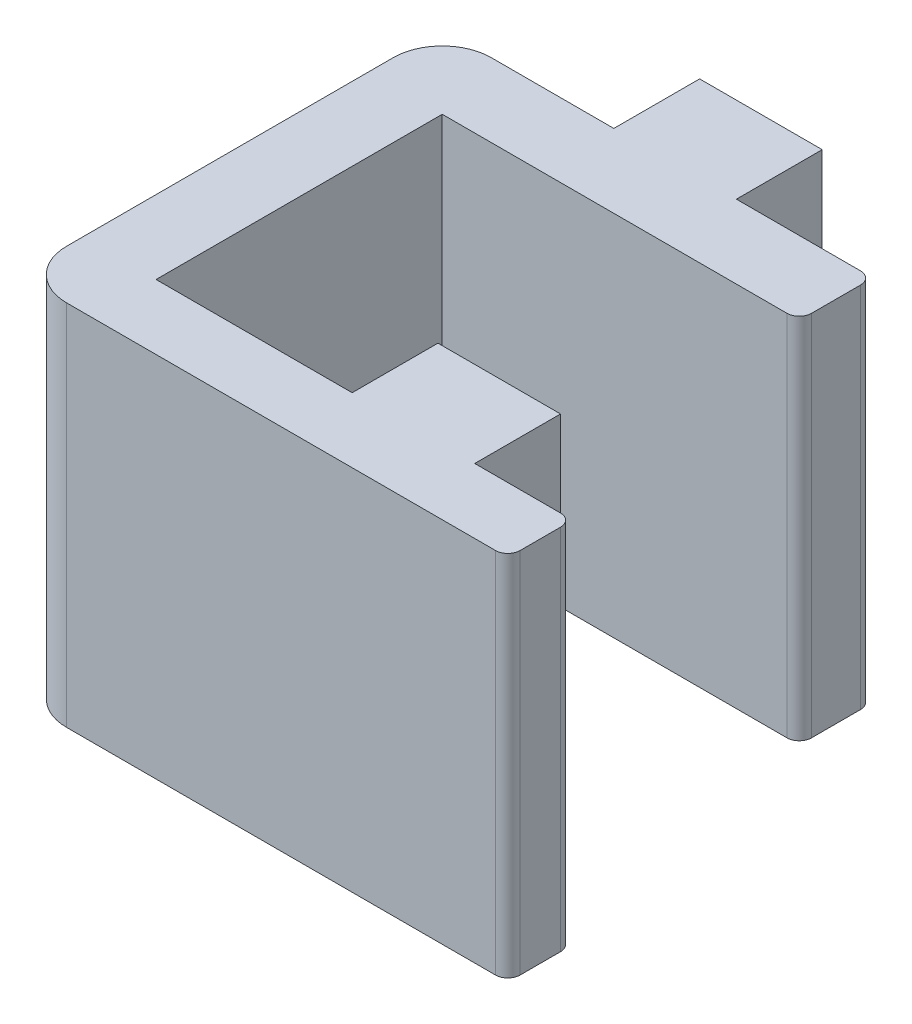
ISO-10303-21;
HEADER;
FILE_DESCRIPTION(('STEP AP214'),'2;1');
FILE_NAME('part.step','',(''),(''),'','','');
FILE_SCHEMA(('AUTOMOTIVE_DESIGN { 1 0 10303 214 1 1 1 1 }'));
ENDSEC;
DATA;
#1=APPLICATION_CONTEXT('core data for automotive mechanical design processes');
#2=APPLICATION_PROTOCOL_DEFINITION('international standard','automotive_design',2000,#1);
#3=PRODUCT_CONTEXT('',#1,'mechanical');
#4=PRODUCT('Part','Part','',(#3));
#5=PRODUCT_RELATED_PRODUCT_CATEGORY('part','',(#4));
#6=PRODUCT_DEFINITION_FORMATION('','',#4);
#7=PRODUCT_DEFINITION_CONTEXT('part definition',#1,'design');
#8=PRODUCT_DEFINITION('design','',#6,#7);
#9=PRODUCT_DEFINITION_SHAPE('','',#8);
#10=(LENGTH_UNIT() NAMED_UNIT(*) SI_UNIT(.MILLI.,.METRE.));
#11=(NAMED_UNIT(*) PLANE_ANGLE_UNIT() SI_UNIT($,.RADIAN.));
#12=(NAMED_UNIT(*) SI_UNIT($,.STERADIAN.) SOLID_ANGLE_UNIT());
#13=UNCERTAINTY_MEASURE_WITH_UNIT(LENGTH_MEASURE(1.E-05),#10,'distance_accuracy_value','');
#14=(GEOMETRIC_REPRESENTATION_CONTEXT(3) GLOBAL_UNCERTAINTY_ASSIGNED_CONTEXT((#13)) GLOBAL_UNIT_ASSIGNED_CONTEXT((#10,
#11,#12)) REPRESENTATION_CONTEXT('',''));
#15=CARTESIAN_POINT('',(0.,0.,0.));
#16=DIRECTION('',(0.,0.,1.));
#17=DIRECTION('',(1.,0.,0.));
#18=AXIS2_PLACEMENT_3D('',#15,#16,#17);
#19=CARTESIAN_POINT('',(-20.,15.,-17.325));
#20=DIRECTION('',(0.,0.,1.));
#21=DIRECTION('',(1.,0.,0.));
#22=AXIS2_PLACEMENT_3D('',#19,#20,#21);
#23=PLANE('',#22);
#24=DIRECTION('',(-1.,0.,0.));
#25=VECTOR('',#24,1.);
#26=CARTESIAN_POINT('',(-20.,0.,-17.325));
#27=LINE('',#26,#25);
#28=CARTESIAN_POINT('',(-13.,0.,-17.325));
#29=VERTEX_POINT('',#28);
#30=CARTESIAN_POINT('',(-18.,0.,-17.325));
#31=VERTEX_POINT('',#30);
#32=EDGE_CURVE('E280',#29,#31,#27,.T.);
#33=ORIENTED_EDGE('',*,*,#32,.T.);
#34=DIRECTION('',(0.,-1.,0.));
#35=VECTOR('',#34,1.);
#36=CARTESIAN_POINT('',(-18.,15.,-17.325));
#37=LINE('',#36,#35);
#38=CARTESIAN_POINT('',(-18.,15.,-17.325));
#39=VERTEX_POINT('',#38);
#40=EDGE_CURVE('E309',#31,#39,#37,.F.);
#41=ORIENTED_EDGE('',*,*,#40,.T.);
#42=DIRECTION('',(-1.,0.,0.));
#43=VECTOR('',#42,1.);
#44=CARTESIAN_POINT('',(-20.,15.,-17.325));
#45=LINE('',#44,#43);
#46=CARTESIAN_POINT('',(-13.,15.,-17.325));
#47=VERTEX_POINT('',#46);
#48=EDGE_CURVE('E258',#47,#39,#45,.T.);
#49=ORIENTED_EDGE('',*,*,#48,.F.);
#50=DIRECTION('',(0.,1.,0.));
#51=VECTOR('',#50,1.);
#52=CARTESIAN_POINT('',(-13.,0.,-17.325));
#53=LINE('',#52,#51);
#54=EDGE_CURVE('E212',#29,#47,#53,.T.);
#55=ORIENTED_EDGE('',*,*,#54,.F.);
#56=EDGE_LOOP('',(#33,#41,#49,#55));
#57=FACE_BOUND('',#56,.T.);
#58=ADVANCED_FACE('F36',(#57),#23,.F.);
#59=CARTESIAN_POINT('',(-2.93547450239907,15.,-17.325));
#60=VERTEX_POINT('',#59);
#61=CARTESIAN_POINT('',(-8.,15.,-17.325));
#62=VERTEX_POINT('',#61);
#63=EDGE_CURVE('E259',#60,#62,#45,.T.);
#64=ORIENTED_EDGE('',*,*,#63,.F.);
#65=DIRECTION('',(0.,-1.,0.));
#66=VECTOR('',#65,1.);
#67=CARTESIAN_POINT('',(-2.93547450239907,15.,-17.325));
#68=LINE('',#67,#66);
#69=CARTESIAN_POINT('',(-2.93547450239907,0.,-17.325));
#70=VERTEX_POINT('',#69);
#71=EDGE_CURVE('E311',#60,#70,#68,.T.);
#72=ORIENTED_EDGE('',*,*,#71,.T.);
#73=CARTESIAN_POINT('',(-8.,0.,-17.325));
#74=VERTEX_POINT('',#73);
#75=EDGE_CURVE('E281',#70,#74,#27,.T.);
#76=ORIENTED_EDGE('',*,*,#75,.T.);
#77=DIRECTION('',(0.,-1.,0.));
#78=VECTOR('',#77,1.);
#79=CARTESIAN_POINT('',(-8.,0.,-17.325));
#80=LINE('',#79,#78);
#81=EDGE_CURVE('E209',#62,#74,#80,.T.);
#82=ORIENTED_EDGE('',*,*,#81,.F.);
#83=EDGE_LOOP('',(#64,#72,#76,#82));
#84=FACE_BOUND('',#83,.T.);
#85=ADVANCED_FACE('F404',(#84),#23,.F.);
#86=CARTESIAN_POINT('',(0.,15.,-2.65));
#87=DIRECTION('',(0.,0.,1.));
#88=DIRECTION('',(1.,0.,0.));
#89=AXIS2_PLACEMENT_3D('',#86,#87,#88);
#90=PLANE('',#89);
#91=DIRECTION('',(0.,1.,0.));
#92=VECTOR('',#91,1.);
#93=CARTESIAN_POINT('',(-9.,0.,-2.65));
#94=LINE('',#93,#92);
#95=CARTESIAN_POINT('',(-9.,0.,-2.65));
#96=VERTEX_POINT('',#95);
#97=CARTESIAN_POINT('',(-9.,15.,-2.65));
#98=VERTEX_POINT('',#97);
#99=EDGE_CURVE('E213',#96,#98,#94,.T.);
#100=ORIENTED_EDGE('',*,*,#99,.F.);
#101=DIRECTION('',(-1.,0.,0.));
#102=VECTOR('',#101,1.);
#103=CARTESIAN_POINT('',(0.,0.,-2.65));
#104=LINE('',#103,#102);
#105=CARTESIAN_POINT('',(-17.,0.,-2.65));
#106=VERTEX_POINT('',#105);
#107=EDGE_CURVE('E270',#96,#106,#104,.T.);
#108=ORIENTED_EDGE('',*,*,#107,.T.);
#109=DIRECTION('',(0.,-1.,0.));
#110=VECTOR('',#109,1.);
#111=CARTESIAN_POINT('',(-17.,15.,-2.65));
#112=LINE('',#111,#110);
#113=CARTESIAN_POINT('',(-17.,15.,-2.65));
#114=VERTEX_POINT('',#113);
#115=EDGE_CURVE('E290',#114,#106,#112,.T.);
#116=ORIENTED_EDGE('',*,*,#115,.F.);
#117=DIRECTION('',(-1.,0.,0.));
#118=VECTOR('',#117,1.);
#119=CARTESIAN_POINT('',(0.,15.,-2.65));
#120=LINE('',#119,#118);
#121=EDGE_CURVE('E248',#98,#114,#120,.T.);
#122=ORIENTED_EDGE('',*,*,#121,.F.);
#123=EDGE_LOOP('',(#100,#108,#116,#122));
#124=FACE_BOUND('',#123,.T.);
#125=ADVANCED_FACE('F382',(#124),#90,.F.);
#126=CARTESIAN_POINT('',(-0.5,15.,-2.65));
#127=VERTEX_POINT('',#126);
#128=CARTESIAN_POINT('',(-4.,15.,-2.65));
#129=VERTEX_POINT('',#128);
#130=EDGE_CURVE('E250',#127,#129,#120,.T.);
#131=ORIENTED_EDGE('',*,*,#130,.F.);
#132=DIRECTION('',(0.,-1.,0.));
#133=VECTOR('',#132,1.);
#134=CARTESIAN_POINT('',(-0.5,15.,-2.65));
#135=LINE('',#134,#133);
#136=CARTESIAN_POINT('',(-0.5,0.,-2.65));
#137=VERTEX_POINT('',#136);
#138=EDGE_CURVE('E11',#127,#137,#135,.T.);
#139=ORIENTED_EDGE('',*,*,#138,.T.);
#140=CARTESIAN_POINT('',(-4.,0.,-2.65));
#141=VERTEX_POINT('',#140);
#142=EDGE_CURVE('E271',#137,#141,#104,.T.);
#143=ORIENTED_EDGE('',*,*,#142,.T.);
#144=DIRECTION('',(0.,-1.,0.));
#145=VECTOR('',#144,1.);
#146=CARTESIAN_POINT('',(-4.,0.,-2.65));
#147=LINE('',#146,#145);
#148=EDGE_CURVE('E216',#129,#141,#147,.T.);
#149=ORIENTED_EDGE('',*,*,#148,.F.);
#150=EDGE_LOOP('',(#131,#139,#143,#149));
#151=FACE_BOUND('',#150,.T.);
#152=ADVANCED_FACE('F362',(#151),#90,.F.);
#153=CARTESIAN_POINT('',(0.,15.,0.));
#154=DIRECTION('',(-1.,0.,0.));
#155=DIRECTION('',(0.,0.,1.));
#156=AXIS2_PLACEMENT_3D('',#153,#154,#155);
#157=PLANE('',#156);
#158=DIRECTION('',(0.,0.,-1.));
#159=VECTOR('',#158,1.);
#160=CARTESIAN_POINT('',(0.,15.,0.));
#161=LINE('',#160,#159);
#162=CARTESIAN_POINT('',(0.,15.,-0.5));
#163=VERTEX_POINT('',#162);
#164=CARTESIAN_POINT('',(0.,15.,-2.15));
#165=VERTEX_POINT('',#164);
#166=EDGE_CURVE('E246',#163,#165,#161,.T.);
#167=ORIENTED_EDGE('',*,*,#166,.F.);
#168=DIRECTION('',(0.,-1.,0.));
#169=VECTOR('',#168,1.);
#170=CARTESIAN_POINT('',(0.,15.,-0.5));
#171=LINE('',#170,#169);
#172=CARTESIAN_POINT('',(0.,0.,-0.5));
#173=VERTEX_POINT('',#172);
#174=EDGE_CURVE('E337',#163,#173,#171,.T.);
#175=ORIENTED_EDGE('',*,*,#174,.T.);
#176=DIRECTION('',(0.,0.,-1.));
#177=VECTOR('',#176,1.);
#178=CARTESIAN_POINT('',(0.,0.,0.));
#179=LINE('',#178,#177);
#180=CARTESIAN_POINT('',(0.,0.,-2.15));
#181=VERTEX_POINT('',#180);
#182=EDGE_CURVE('E245',#173,#181,#179,.T.);
#183=ORIENTED_EDGE('',*,*,#182,.T.);
#184=DIRECTION('',(0.,-1.,0.));
#185=VECTOR('',#184,1.);
#186=CARTESIAN_POINT('',(0.,15.,-2.15));
#187=LINE('',#186,#185);
#188=EDGE_CURVE('E335',#181,#165,#187,.F.);
#189=ORIENTED_EDGE('',*,*,#188,.T.);
#190=EDGE_LOOP('',(#167,#175,#183,#189));
#191=FACE_BOUND('',#190,.T.);
#192=ADVANCED_FACE('F353',(#191),#157,.F.);
#193=CARTESIAN_POINT('',(-17.,15.,-2.65));
#194=DIRECTION('',(-1.,0.,0.));
#195=DIRECTION('',(0.,0.,1.));
#196=AXIS2_PLACEMENT_3D('',#193,#194,#195);
#197=PLANE('',#196);
#198=DIRECTION('',(0.,0.,-1.));
#199=VECTOR('',#198,1.);
#200=CARTESIAN_POINT('',(-17.,0.,-2.65));
#201=LINE('',#200,#199);
#202=CARTESIAN_POINT('',(-17.,0.,-14.325));
#203=VERTEX_POINT('',#202);
#204=EDGE_CURVE('E273',#106,#203,#201,.T.);
#205=ORIENTED_EDGE('',*,*,#204,.T.);
#206=DIRECTION('',(0.,-1.,0.));
#207=VECTOR('',#206,1.);
#208=CARTESIAN_POINT('',(-17.,15.,-14.325));
#209=LINE('',#208,#207);
#210=CARTESIAN_POINT('',(-17.,15.,-14.325));
#211=VERTEX_POINT('',#210);
#212=EDGE_CURVE('E267',#211,#203,#209,.T.);
#213=ORIENTED_EDGE('',*,*,#212,.F.);
#214=DIRECTION('',(0.,0.,-1.));
#215=VECTOR('',#214,1.);
#216=CARTESIAN_POINT('',(-17.,15.,-2.65));
#217=LINE('',#216,#215);
#218=EDGE_CURVE('E252',#114,#211,#217,.T.);
#219=ORIENTED_EDGE('',*,*,#218,.F.);
#220=ORIENTED_EDGE('',*,*,#115,.T.);
#221=EDGE_LOOP('',(#205,#213,#219,#220));
#222=FACE_BOUND('',#221,.T.);
#223=ADVANCED_FACE('F385',(#222),#197,.F.);
#224=CARTESIAN_POINT('',(-17.,15.,-14.325));
#225=DIRECTION('',(0.,0.,-1.));
#226=DIRECTION('',(-1.,0.,0.));
#227=AXIS2_PLACEMENT_3D('',#224,#225,#226);
#228=PLANE('',#227);
#229=DIRECTION('',(1.,0.,0.));
#230=VECTOR('',#229,1.);
#231=CARTESIAN_POINT('',(-17.,0.,-14.325));
#232=LINE('',#231,#230);
#233=CARTESIAN_POINT('',(-2.93547450239907,0.,-14.325));
#234=VERTEX_POINT('',#233);
#235=EDGE_CURVE('E275',#203,#234,#232,.T.);
#236=ORIENTED_EDGE('',*,*,#235,.T.);
#237=DIRECTION('',(0.,-1.,0.));
#238=VECTOR('',#237,1.);
#239=CARTESIAN_POINT('',(-2.93547450239907,15.,-14.325));
#240=LINE('',#239,#238);
#241=CARTESIAN_POINT('',(-2.93547450239907,15.,-14.325));
#242=VERTEX_POINT('',#241);
#243=EDGE_CURVE('E51',#234,#242,#240,.F.);
#244=ORIENTED_EDGE('',*,*,#243,.T.);
#245=DIRECTION('',(1.,0.,0.));
#246=VECTOR('',#245,1.);
#247=CARTESIAN_POINT('',(-17.,15.,-14.325));
#248=LINE('',#247,#246);
#249=EDGE_CURVE('E254',#211,#242,#248,.T.);
#250=ORIENTED_EDGE('',*,*,#249,.F.);
#251=ORIENTED_EDGE('',*,*,#212,.T.);
#252=EDGE_LOOP('',(#236,#244,#250,#251));
#253=FACE_BOUND('',#252,.T.);
#254=ADVANCED_FACE('F387',(#253),#228,.F.);
#255=CARTESIAN_POINT('',(-2.43547450239907,15.,-17.325));
#256=DIRECTION('',(-1.,0.,0.));
#257=DIRECTION('',(0.,0.,1.));
#258=AXIS2_PLACEMENT_3D('',#255,#256,#257);
#259=PLANE('',#258);
#260=DIRECTION('',(0.,0.,-1.));
#261=VECTOR('',#260,1.);
#262=CARTESIAN_POINT('',(-2.43547450239907,0.,-17.325));
#263=LINE('',#262,#261);
#264=CARTESIAN_POINT('',(-2.43547450239907,0.,-14.825));
#265=VERTEX_POINT('',#264);
#266=CARTESIAN_POINT('',(-2.43547450239907,0.,-16.825));
#267=VERTEX_POINT('',#266);
#268=EDGE_CURVE('E277',#265,#267,#263,.T.);
#269=ORIENTED_EDGE('',*,*,#268,.T.);
#270=DIRECTION('',(0.,-1.,0.));
#271=VECTOR('',#270,1.);
#272=CARTESIAN_POINT('',(-2.43547450239907,15.,-16.825));
#273=LINE('',#272,#271);
#274=CARTESIAN_POINT('',(-2.43547450239907,15.,-16.825));
#275=VERTEX_POINT('',#274);
#276=EDGE_CURVE('E325',#267,#275,#273,.F.);
#277=ORIENTED_EDGE('',*,*,#276,.T.);
#278=DIRECTION('',(0.,0.,-1.));
#279=VECTOR('',#278,1.);
#280=CARTESIAN_POINT('',(-2.43547450239907,15.,-17.325));
#281=LINE('',#280,#279);
#282=CARTESIAN_POINT('',(-2.43547450239907,15.,-14.825));
#283=VERTEX_POINT('',#282);
#284=EDGE_CURVE('E256',#283,#275,#281,.T.);
#285=ORIENTED_EDGE('',*,*,#284,.F.);
#286=DIRECTION('',(0.,-1.,0.));
#287=VECTOR('',#286,1.);
#288=CARTESIAN_POINT('',(-2.43547450239907,15.,-14.825));
#289=LINE('',#288,#287);
#290=EDGE_CURVE('E322',#283,#265,#289,.T.);
#291=ORIENTED_EDGE('',*,*,#290,.T.);
#292=EDGE_LOOP('',(#269,#277,#285,#291));
#293=FACE_BOUND('',#292,.T.);
#294=ADVANCED_FACE('F395',(#293),#259,.F.);
#295=CARTESIAN_POINT('',(-20.,15.,0.));
#296=DIRECTION('',(1.,0.,0.));
#297=DIRECTION('',(0.,0.,-1.));
#298=AXIS2_PLACEMENT_3D('',#295,#296,#297);
#299=PLANE('',#298);
#300=DIRECTION('',(0.,0.,1.));
#301=VECTOR('',#300,1.);
#302=CARTESIAN_POINT('',(-20.,0.,0.));
#303=LINE('',#302,#301);
#304=CARTESIAN_POINT('',(-20.,0.,-15.325));
#305=VERTEX_POINT('',#304);
#306=CARTESIAN_POINT('',(-20.,0.,-2.));
#307=VERTEX_POINT('',#306);
#308=EDGE_CURVE('E283',#305,#307,#303,.T.);
#309=ORIENTED_EDGE('',*,*,#308,.T.);
#310=DIRECTION('',(0.,-1.,0.));
#311=VECTOR('',#310,1.);
#312=CARTESIAN_POINT('',(-20.,15.,-2.));
#313=LINE('',#312,#311);
#314=CARTESIAN_POINT('',(-20.,15.,-2.));
#315=VERTEX_POINT('',#314);
#316=EDGE_CURVE('E303',#307,#315,#313,.F.);
#317=ORIENTED_EDGE('',*,*,#316,.T.);
#318=DIRECTION('',(0.,0.,1.));
#319=VECTOR('',#318,1.);
#320=CARTESIAN_POINT('',(-20.,15.,0.));
#321=LINE('',#320,#319);
#322=CARTESIAN_POINT('',(-20.,15.,-15.325));
#323=VERTEX_POINT('',#322);
#324=EDGE_CURVE('E261',#323,#315,#321,.T.);
#325=ORIENTED_EDGE('',*,*,#324,.F.);
#326=DIRECTION('',(0.,-1.,0.));
#327=VECTOR('',#326,1.);
#328=CARTESIAN_POINT('',(-20.,15.,-15.325));
#329=LINE('',#328,#327);
#330=EDGE_CURVE('E300',#323,#305,#329,.T.);
#331=ORIENTED_EDGE('',*,*,#330,.T.);
#332=EDGE_LOOP('',(#309,#317,#325,#331));
#333=FACE_BOUND('',#332,.T.);
#334=ADVANCED_FACE('F427',(#333),#299,.F.);
#335=CARTESIAN_POINT('',(0.,15.,0.));
#336=DIRECTION('',(0.,0.,-1.));
#337=DIRECTION('',(-1.,0.,0.));
#338=AXIS2_PLACEMENT_3D('',#335,#336,#337);
#339=PLANE('',#338);
#340=DIRECTION('',(1.,0.,0.));
#341=VECTOR('',#340,1.);
#342=CARTESIAN_POINT('',(0.,0.,0.));
#343=LINE('',#342,#341);
#344=CARTESIAN_POINT('',(-18.,0.,0.));
#345=VERTEX_POINT('',#344);
#346=CARTESIAN_POINT('',(-0.5,0.,0.));
#347=VERTEX_POINT('',#346);
#348=EDGE_CURVE('E249',#345,#347,#343,.T.);
#349=ORIENTED_EDGE('',*,*,#348,.T.);
#350=DIRECTION('',(0.,-1.,0.));
#351=VECTOR('',#350,1.);
#352=CARTESIAN_POINT('',(-0.5,15.,0.));
#353=LINE('',#352,#351);
#354=CARTESIAN_POINT('',(-0.5,15.,0.));
#355=VERTEX_POINT('',#354);
#356=EDGE_CURVE('E44',#347,#355,#353,.F.);
#357=ORIENTED_EDGE('',*,*,#356,.T.);
#358=DIRECTION('',(1.,0.,0.));
#359=VECTOR('',#358,1.);
#360=CARTESIAN_POINT('',(0.,15.,0.));
#361=LINE('',#360,#359);
#362=CARTESIAN_POINT('',(-18.,15.,0.));
#363=VERTEX_POINT('',#362);
#364=EDGE_CURVE('E264',#363,#355,#361,.T.);
#365=ORIENTED_EDGE('',*,*,#364,.F.);
#366=DIRECTION('',(0.,-1.,0.));
#367=VECTOR('',#366,1.);
#368=CARTESIAN_POINT('',(-18.,15.,0.));
#369=LINE('',#368,#367);
#370=EDGE_CURVE('E293',#363,#345,#369,.T.);
#371=ORIENTED_EDGE('',*,*,#370,.T.);
#372=EDGE_LOOP('',(#349,#357,#365,#371));
#373=FACE_BOUND('',#372,.T.);
#374=ADVANCED_FACE('F342',(#373),#339,.F.);
#375=CARTESIAN_POINT('',(0.,15.,0.));
#376=DIRECTION('',(0.,1.,0.));
#377=DIRECTION('',(0.,0.,1.));
#378=AXIS2_PLACEMENT_3D('',#375,#376,#377);
#379=PLANE('',#378);
#380=ORIENTED_EDGE('',*,*,#284,.T.);
#381=CARTESIAN_POINT('',(-2.93547450239907,15.,-16.825));
#382=DIRECTION('',(0.,1.,0.));
#383=DIRECTION('',(0.,0.,1.));
#384=AXIS2_PLACEMENT_3D('',#381,#382,#383);
#385=CIRCLE('',#384,0.5);
#386=EDGE_CURVE('E332',#275,#60,#385,.T.);
#387=ORIENTED_EDGE('',*,*,#386,.T.);
#388=ORIENTED_EDGE('',*,*,#63,.T.);
#389=DIRECTION('',(0.,0.,1.));
#390=VECTOR('',#389,1.);
#391=CARTESIAN_POINT('',(-8.,15.,-20.825));
#392=LINE('',#391,#390);
#393=CARTESIAN_POINT('',(-8.,15.,-20.825));
#394=VERTEX_POINT('',#393);
#395=EDGE_CURVE('E196',#394,#62,#392,.T.);
#396=ORIENTED_EDGE('',*,*,#395,.F.);
#397=DIRECTION('',(1.,0.,0.));
#398=VECTOR('',#397,1.);
#399=CARTESIAN_POINT('',(-13.,15.,-20.825));
#400=LINE('',#399,#398);
#401=CARTESIAN_POINT('',(-13.,15.,-20.825));
#402=VERTEX_POINT('',#401);
#403=EDGE_CURVE('E187',#402,#394,#400,.T.);
#404=ORIENTED_EDGE('',*,*,#403,.F.);
#405=DIRECTION('',(0.,0.,1.));
#406=VECTOR('',#405,1.);
#407=CARTESIAN_POINT('',(-13.,15.,-20.825));
#408=LINE('',#407,#406);
#409=EDGE_CURVE('E193',#402,#47,#408,.T.);
#410=ORIENTED_EDGE('',*,*,#409,.T.);
#411=ORIENTED_EDGE('',*,*,#48,.T.);
#412=CARTESIAN_POINT('',(-18.,15.,-15.325));
#413=DIRECTION('',(0.,1.,0.));
#414=DIRECTION('',(0.,0.,1.));
#415=AXIS2_PLACEMENT_3D('',#412,#413,#414);
#416=CIRCLE('',#415,2.);
#417=EDGE_CURVE('E305',#39,#323,#416,.T.);
#418=ORIENTED_EDGE('',*,*,#417,.T.);
#419=ORIENTED_EDGE('',*,*,#324,.T.);
#420=CARTESIAN_POINT('',(-18.,15.,-2.));
#421=DIRECTION('',(0.,1.,0.));
#422=DIRECTION('',(0.,0.,1.));
#423=AXIS2_PLACEMENT_3D('',#420,#421,#422);
#424=CIRCLE('',#423,2.);
#425=EDGE_CURVE('E307',#315,#363,#424,.T.);
#426=ORIENTED_EDGE('',*,*,#425,.T.);
#427=ORIENTED_EDGE('',*,*,#364,.T.);
#428=CARTESIAN_POINT('',(-0.5,15.,-0.5));
#429=DIRECTION('',(0.,1.,0.));
#430=DIRECTION('',(0.,0.,1.));
#431=AXIS2_PLACEMENT_3D('',#428,#429,#430);
#432=CIRCLE('',#431,0.5);
#433=EDGE_CURVE('E328',#355,#163,#432,.T.);
#434=ORIENTED_EDGE('',*,*,#433,.T.);
#435=ORIENTED_EDGE('',*,*,#166,.T.);
#436=CARTESIAN_POINT('',(-0.5,15.,-2.15));
#437=DIRECTION('',(0.,1.,0.));
#438=DIRECTION('',(0.,0.,1.));
#439=AXIS2_PLACEMENT_3D('',#436,#437,#438);
#440=CIRCLE('',#439,0.5);
#441=EDGE_CURVE('E59',#165,#127,#440,.T.);
#442=ORIENTED_EDGE('',*,*,#441,.T.);
#443=ORIENTED_EDGE('',*,*,#130,.T.);
#444=DIRECTION('',(0.,0.,1.));
#445=VECTOR('',#444,1.);
#446=CARTESIAN_POINT('',(-4.,15.,-6.15));
#447=LINE('',#446,#445);
#448=CARTESIAN_POINT('',(-4.,15.,-6.15));
#449=VERTEX_POINT('',#448);
#450=EDGE_CURVE('E239',#449,#129,#447,.T.);
#451=ORIENTED_EDGE('',*,*,#450,.F.);
#452=DIRECTION('',(1.,0.,0.));
#453=VECTOR('',#452,1.);
#454=CARTESIAN_POINT('',(-9.,15.,-6.15));
#455=LINE('',#454,#453);
#456=CARTESIAN_POINT('',(-9.,15.,-6.15));
#457=VERTEX_POINT('',#456);
#458=EDGE_CURVE('E225',#457,#449,#455,.T.);
#459=ORIENTED_EDGE('',*,*,#458,.F.);
#460=DIRECTION('',(0.,0.,1.));
#461=VECTOR('',#460,1.);
#462=CARTESIAN_POINT('',(-9.,15.,-6.15));
#463=LINE('',#462,#461);
#464=EDGE_CURVE('E242',#457,#98,#463,.T.);
#465=ORIENTED_EDGE('',*,*,#464,.T.);
#466=ORIENTED_EDGE('',*,*,#121,.T.);
#467=ORIENTED_EDGE('',*,*,#218,.T.);
#468=ORIENTED_EDGE('',*,*,#249,.T.);
#469=CARTESIAN_POINT('',(-2.93547450239907,15.,-14.825));
#470=DIRECTION('',(0.,1.,0.));
#471=DIRECTION('',(0.,0.,1.));
#472=AXIS2_PLACEMENT_3D('',#469,#470,#471);
#473=CIRCLE('',#472,0.5);
#474=EDGE_CURVE('E330',#242,#283,#473,.T.);
#475=ORIENTED_EDGE('',*,*,#474,.T.);
#476=EDGE_LOOP('',(#380,#387,#388,#396,#404,#410,#411,#418,#419,#426,#427,#434,#435,#442,#443,
#451,#459,#465,#466,#467,#468,#475));
#477=FACE_BOUND('',#476,.T.);
#478=ADVANCED_FACE('F190',(#477),#379,.T.);
#479=CARTESIAN_POINT('',(0.,0.,0.));
#480=DIRECTION('',(0.,1.,0.));
#481=DIRECTION('',(0.,0.,1.));
#482=AXIS2_PLACEMENT_3D('',#479,#480,#481);
#483=PLANE('',#482);
#484=ORIENTED_EDGE('',*,*,#75,.F.);
#485=CARTESIAN_POINT('',(-2.93547450239907,0.,-16.825));
#486=DIRECTION('',(0.,1.,0.));
#487=DIRECTION('',(0.,0.,1.));
#488=AXIS2_PLACEMENT_3D('',#485,#486,#487);
#489=CIRCLE('',#488,0.5);
#490=EDGE_CURVE('E320',#70,#267,#489,.F.);
#491=ORIENTED_EDGE('',*,*,#490,.T.);
#492=ORIENTED_EDGE('',*,*,#268,.F.);
#493=CARTESIAN_POINT('',(-2.93547450239907,0.,-14.825));
#494=DIRECTION('',(0.,1.,0.));
#495=DIRECTION('',(0.,0.,1.));
#496=AXIS2_PLACEMENT_3D('',#493,#494,#495);
#497=CIRCLE('',#496,0.5);
#498=EDGE_CURVE('E318',#265,#234,#497,.F.);
#499=ORIENTED_EDGE('',*,*,#498,.T.);
#500=ORIENTED_EDGE('',*,*,#235,.F.);
#501=ORIENTED_EDGE('',*,*,#204,.F.);
#502=ORIENTED_EDGE('',*,*,#107,.F.);
#503=DIRECTION('',(0.,0.,1.));
#504=VECTOR('',#503,1.);
#505=CARTESIAN_POINT('',(-9.,0.,-6.15));
#506=LINE('',#505,#504);
#507=CARTESIAN_POINT('',(-9.,0.,-6.15));
#508=VERTEX_POINT('',#507);
#509=EDGE_CURVE('E230',#508,#96,#506,.T.);
#510=ORIENTED_EDGE('',*,*,#509,.F.);
#511=DIRECTION('',(-1.,0.,0.));
#512=VECTOR('',#511,1.);
#513=CARTESIAN_POINT('',(-9.,0.,-6.15));
#514=LINE('',#513,#512);
#515=CARTESIAN_POINT('',(-4.,0.,-6.15));
#516=VERTEX_POINT('',#515);
#517=EDGE_CURVE('E229',#516,#508,#514,.T.);
#518=ORIENTED_EDGE('',*,*,#517,.F.);
#519=DIRECTION('',(0.,0.,1.));
#520=VECTOR('',#519,1.);
#521=CARTESIAN_POINT('',(-4.,0.,-6.15));
#522=LINE('',#521,#520);
#523=EDGE_CURVE('E236',#516,#141,#522,.T.);
#524=ORIENTED_EDGE('',*,*,#523,.T.);
#525=ORIENTED_EDGE('',*,*,#142,.F.);
#526=CARTESIAN_POINT('',(-0.5,0.,-2.15));
#527=DIRECTION('',(0.,1.,0.));
#528=DIRECTION('',(0.,0.,1.));
#529=AXIS2_PLACEMENT_3D('',#526,#527,#528);
#530=CIRCLE('',#529,0.5);
#531=EDGE_CURVE('E314',#137,#181,#530,.F.);
#532=ORIENTED_EDGE('',*,*,#531,.T.);
#533=ORIENTED_EDGE('',*,*,#182,.F.);
#534=CARTESIAN_POINT('',(-0.5,0.,-0.5));
#535=DIRECTION('',(0.,1.,0.));
#536=DIRECTION('',(0.,0.,1.));
#537=AXIS2_PLACEMENT_3D('',#534,#535,#536);
#538=CIRCLE('',#537,0.5);
#539=EDGE_CURVE('E316',#173,#347,#538,.F.);
#540=ORIENTED_EDGE('',*,*,#539,.T.);
#541=ORIENTED_EDGE('',*,*,#348,.F.);
#542=CARTESIAN_POINT('',(-18.,0.,-2.));
#543=DIRECTION('',(0.,1.,0.));
#544=DIRECTION('',(0.,0.,1.));
#545=AXIS2_PLACEMENT_3D('',#542,#543,#544);
#546=CIRCLE('',#545,2.);
#547=EDGE_CURVE('E298',#345,#307,#546,.F.);
#548=ORIENTED_EDGE('',*,*,#547,.T.);
#549=ORIENTED_EDGE('',*,*,#308,.F.);
#550=CARTESIAN_POINT('',(-18.,0.,-15.325));
#551=DIRECTION('',(0.,1.,0.));
#552=DIRECTION('',(0.,0.,1.));
#553=AXIS2_PLACEMENT_3D('',#550,#551,#552);
#554=CIRCLE('',#553,2.);
#555=EDGE_CURVE('E296',#305,#31,#554,.F.);
#556=ORIENTED_EDGE('',*,*,#555,.T.);
#557=ORIENTED_EDGE('',*,*,#32,.F.);
#558=DIRECTION('',(0.,0.,1.));
#559=VECTOR('',#558,1.);
#560=CARTESIAN_POINT('',(-13.,0.,-20.825));
#561=LINE('',#560,#559);
#562=CARTESIAN_POINT('',(-13.,0.,-20.825));
#563=VERTEX_POINT('',#562);
#564=EDGE_CURVE('E412',#563,#29,#561,.T.);
#565=ORIENTED_EDGE('',*,*,#564,.F.);
#566=DIRECTION('',(-1.,0.,0.));
#567=VECTOR('',#566,1.);
#568=CARTESIAN_POINT('',(-13.,0.,-20.825));
#569=LINE('',#568,#567);
#570=CARTESIAN_POINT('',(-8.,0.,-20.825));
#571=VERTEX_POINT('',#570);
#572=EDGE_CURVE('E205',#571,#563,#569,.T.);
#573=ORIENTED_EDGE('',*,*,#572,.F.);
#574=DIRECTION('',(0.,0.,1.));
#575=VECTOR('',#574,1.);
#576=CARTESIAN_POINT('',(-8.,0.,-20.825));
#577=LINE('',#576,#575);
#578=EDGE_CURVE('E218',#571,#74,#577,.T.);
#579=ORIENTED_EDGE('',*,*,#578,.T.);
#580=EDGE_LOOP('',(#484,#491,#492,#499,#500,#501,#502,#510,#518,#524,#525,#532,#533,#540,#541,
#548,#549,#556,#557,#565,#573,#579));
#581=FACE_BOUND('',#580,.T.);
#582=ADVANCED_FACE('F357',(#581),#483,.F.);
#583=CARTESIAN_POINT('',(-9.,0.,-6.15));
#584=DIRECTION('',(1.,0.,0.));
#585=DIRECTION('',(0.,0.,-1.));
#586=AXIS2_PLACEMENT_3D('',#583,#584,#585);
#587=PLANE('',#586);
#588=ORIENTED_EDGE('',*,*,#99,.T.);
#589=ORIENTED_EDGE('',*,*,#464,.F.);
#590=DIRECTION('',(0.,1.,0.));
#591=VECTOR('',#590,1.);
#592=CARTESIAN_POINT('',(-9.,0.,-6.15));
#593=LINE('',#592,#591);
#594=EDGE_CURVE('E222',#508,#457,#593,.T.);
#595=ORIENTED_EDGE('',*,*,#594,.F.);
#596=ORIENTED_EDGE('',*,*,#509,.T.);
#597=EDGE_LOOP('',(#588,#589,#595,#596));
#598=FACE_BOUND('',#597,.T.);
#599=ADVANCED_FACE('F376',(#598),#587,.F.);
#600=CARTESIAN_POINT('',(-4.,0.,-6.15));
#601=DIRECTION('',(-1.,0.,0.));
#602=DIRECTION('',(0.,0.,1.));
#603=AXIS2_PLACEMENT_3D('',#600,#601,#602);
#604=PLANE('',#603);
#605=ORIENTED_EDGE('',*,*,#148,.T.);
#606=ORIENTED_EDGE('',*,*,#523,.F.);
#607=DIRECTION('',(0.,-1.,0.));
#608=VECTOR('',#607,1.);
#609=CARTESIAN_POINT('',(-4.,0.,-6.15));
#610=LINE('',#609,#608);
#611=EDGE_CURVE('E227',#449,#516,#610,.T.);
#612=ORIENTED_EDGE('',*,*,#611,.F.);
#613=ORIENTED_EDGE('',*,*,#450,.T.);
#614=EDGE_LOOP('',(#605,#606,#612,#613));
#615=FACE_BOUND('',#614,.T.);
#616=ADVANCED_FACE('F368',(#615),#604,.F.);
#617=CARTESIAN_POINT('',(0.,0.,-6.15));
#618=DIRECTION('',(0.,0.,-1.));
#619=DIRECTION('',(-1.,0.,0.));
#620=AXIS2_PLACEMENT_3D('',#617,#618,#619);
#621=PLANE('',#620);
#622=ORIENTED_EDGE('',*,*,#594,.T.);
#623=ORIENTED_EDGE('',*,*,#458,.T.);
#624=ORIENTED_EDGE('',*,*,#611,.T.);
#625=ORIENTED_EDGE('',*,*,#517,.T.);
#626=EDGE_LOOP('',(#622,#623,#624,#625));
#627=FACE_BOUND('',#626,.T.);
#628=ADVANCED_FACE('F371',(#627),#621,.T.);
#629=CARTESIAN_POINT('',(-13.,0.,-20.825));
#630=DIRECTION('',(1.,0.,0.));
#631=DIRECTION('',(0.,0.,-1.));
#632=AXIS2_PLACEMENT_3D('',#629,#630,#631);
#633=PLANE('',#632);
#634=ORIENTED_EDGE('',*,*,#54,.T.);
#635=ORIENTED_EDGE('',*,*,#409,.F.);
#636=DIRECTION('',(0.,1.,0.));
#637=VECTOR('',#636,1.);
#638=CARTESIAN_POINT('',(-13.,0.,-20.825));
#639=LINE('',#638,#637);
#640=EDGE_CURVE('E200',#563,#402,#639,.T.);
#641=ORIENTED_EDGE('',*,*,#640,.F.);
#642=ORIENTED_EDGE('',*,*,#564,.T.);
#643=EDGE_LOOP('',(#634,#635,#641,#642));
#644=FACE_BOUND('',#643,.T.);
#645=ADVANCED_FACE('F211',(#644),#633,.F.);
#646=CARTESIAN_POINT('',(-8.,0.,-20.825));
#647=DIRECTION('',(-1.,0.,0.));
#648=DIRECTION('',(0.,0.,1.));
#649=AXIS2_PLACEMENT_3D('',#646,#647,#648);
#650=PLANE('',#649);
#651=ORIENTED_EDGE('',*,*,#81,.T.);
#652=ORIENTED_EDGE('',*,*,#578,.F.);
#653=DIRECTION('',(0.,-1.,0.));
#654=VECTOR('',#653,1.);
#655=CARTESIAN_POINT('',(-8.,0.,-20.825));
#656=LINE('',#655,#654);
#657=EDGE_CURVE('E199',#394,#571,#656,.T.);
#658=ORIENTED_EDGE('',*,*,#657,.F.);
#659=ORIENTED_EDGE('',*,*,#395,.T.);
#660=EDGE_LOOP('',(#651,#652,#658,#659));
#661=FACE_BOUND('',#660,.T.);
#662=ADVANCED_FACE('F410',(#661),#650,.F.);
#663=CARTESIAN_POINT('',(0.,0.,-20.825));
#664=DIRECTION('',(0.,0.,-1.));
#665=DIRECTION('',(-1.,0.,0.));
#666=AXIS2_PLACEMENT_3D('',#663,#664,#665);
#667=PLANE('',#666);
#668=ORIENTED_EDGE('',*,*,#640,.T.);
#669=ORIENTED_EDGE('',*,*,#403,.T.);
#670=ORIENTED_EDGE('',*,*,#657,.T.);
#671=ORIENTED_EDGE('',*,*,#572,.T.);
#672=EDGE_LOOP('',(#668,#669,#670,#671));
#673=FACE_BOUND('',#672,.T.);
#674=ADVANCED_FACE('F203',(#673),#667,.T.);
#675=CARTESIAN_POINT('',(-18.,15.,-2.));
#676=DIRECTION('',(0.,-1.,0.));
#677=DIRECTION('',(0.,0.,-1.));
#678=AXIS2_PLACEMENT_3D('',#675,#676,#677);
#679=CYLINDRICAL_SURFACE('',#678,2.);
#680=ORIENTED_EDGE('',*,*,#425,.F.);
#681=ORIENTED_EDGE('',*,*,#316,.F.);
#682=ORIENTED_EDGE('',*,*,#547,.F.);
#683=ORIENTED_EDGE('',*,*,#370,.F.);
#684=EDGE_LOOP('',(#680,#681,#682,#683));
#685=FACE_BOUND('',#684,.T.);
#686=ADVANCED_FACE('F430',(#685),#679,.T.);
#687=CARTESIAN_POINT('',(-18.,15.,-15.325));
#688=DIRECTION('',(0.,-1.,0.));
#689=DIRECTION('',(0.,0.,-1.));
#690=AXIS2_PLACEMENT_3D('',#687,#688,#689);
#691=CYLINDRICAL_SURFACE('',#690,2.);
#692=ORIENTED_EDGE('',*,*,#417,.F.);
#693=ORIENTED_EDGE('',*,*,#40,.F.);
#694=ORIENTED_EDGE('',*,*,#555,.F.);
#695=ORIENTED_EDGE('',*,*,#330,.F.);
#696=EDGE_LOOP('',(#692,#693,#694,#695));
#697=FACE_BOUND('',#696,.T.);
#698=ADVANCED_FACE('F423',(#697),#691,.T.);
#699=CARTESIAN_POINT('',(-2.93547450239907,15.,-16.825));
#700=DIRECTION('',(0.,-1.,0.));
#701=DIRECTION('',(0.,0.,-1.));
#702=AXIS2_PLACEMENT_3D('',#699,#700,#701);
#703=CYLINDRICAL_SURFACE('',#702,0.5);
#704=ORIENTED_EDGE('',*,*,#386,.F.);
#705=ORIENTED_EDGE('',*,*,#276,.F.);
#706=ORIENTED_EDGE('',*,*,#490,.F.);
#707=ORIENTED_EDGE('',*,*,#71,.F.);
#708=EDGE_LOOP('',(#704,#705,#706,#707));
#709=FACE_BOUND('',#708,.T.);
#710=ADVANCED_FACE('F401',(#709),#703,.T.);
#711=CARTESIAN_POINT('',(-2.93547450239907,15.,-14.825));
#712=DIRECTION('',(0.,-1.,0.));
#713=DIRECTION('',(0.,0.,-1.));
#714=AXIS2_PLACEMENT_3D('',#711,#712,#713);
#715=CYLINDRICAL_SURFACE('',#714,0.5);
#716=ORIENTED_EDGE('',*,*,#474,.F.);
#717=ORIENTED_EDGE('',*,*,#243,.F.);
#718=ORIENTED_EDGE('',*,*,#498,.F.);
#719=ORIENTED_EDGE('',*,*,#290,.F.);
#720=EDGE_LOOP('',(#716,#717,#718,#719));
#721=FACE_BOUND('',#720,.T.);
#722=ADVANCED_FACE('F392',(#721),#715,.T.);
#723=CARTESIAN_POINT('',(-0.5,15.,-0.5));
#724=DIRECTION('',(0.,-1.,0.));
#725=DIRECTION('',(0.,0.,-1.));
#726=AXIS2_PLACEMENT_3D('',#723,#724,#725);
#727=CYLINDRICAL_SURFACE('',#726,0.5);
#728=ORIENTED_EDGE('',*,*,#433,.F.);
#729=ORIENTED_EDGE('',*,*,#356,.F.);
#730=ORIENTED_EDGE('',*,*,#539,.F.);
#731=ORIENTED_EDGE('',*,*,#174,.F.);
#732=EDGE_LOOP('',(#728,#729,#730,#731));
#733=FACE_BOUND('',#732,.T.);
#734=ADVANCED_FACE('F350',(#733),#727,.T.);
#735=CARTESIAN_POINT('',(-0.5,15.,-2.15));
#736=DIRECTION('',(0.,-1.,0.));
#737=DIRECTION('',(0.,0.,-1.));
#738=AXIS2_PLACEMENT_3D('',#735,#736,#737);
#739=CYLINDRICAL_SURFACE('',#738,0.5);
#740=ORIENTED_EDGE('',*,*,#441,.F.);
#741=ORIENTED_EDGE('',*,*,#188,.F.);
#742=ORIENTED_EDGE('',*,*,#531,.F.);
#743=ORIENTED_EDGE('',*,*,#138,.F.);
#744=EDGE_LOOP('',(#740,#741,#742,#743));
#745=FACE_BOUND('',#744,.T.);
#746=ADVANCED_FACE('F38',(#745),#739,.T.);
#747=CLOSED_SHELL('',(#58,#85,#125,#152,#192,#223,#254,#294,#334,#374,#478,#582,#599,#616,#628,
#645,#662,#674,#686,#698,#710,#722,#734,#746));
#748=MANIFOLD_SOLID_BREP('B2',#747);
#749=ADVANCED_BREP_SHAPE_REPRESENTATION('',(#18,#748),#14);
#750=SHAPE_DEFINITION_REPRESENTATION(#9,#749);
ENDSEC;
END-ISO-10303-21;
